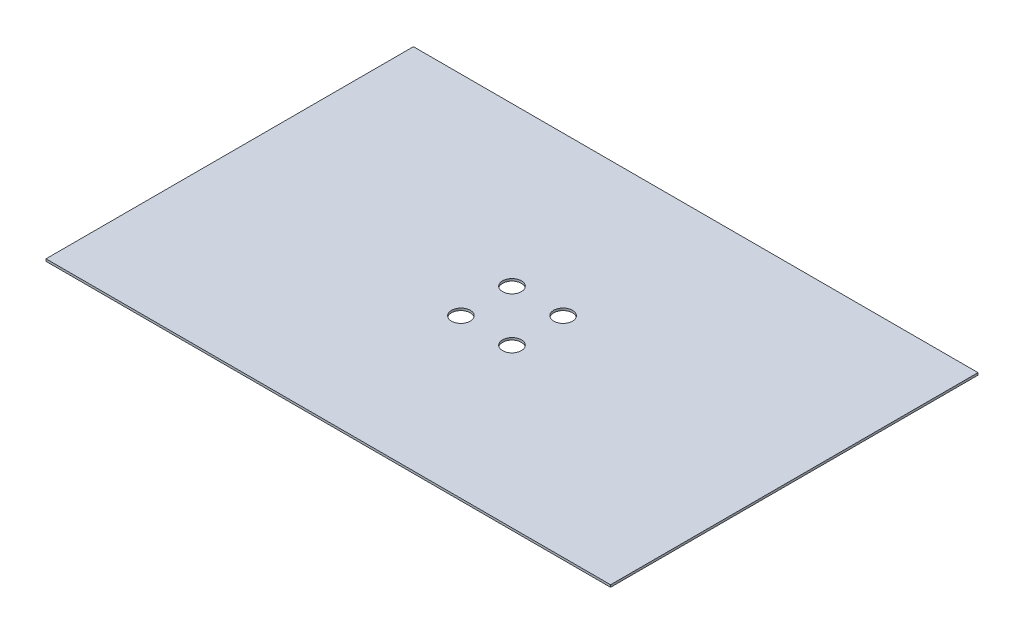
ISO-10303-21;
HEADER;
FILE_DESCRIPTION(('STEP AP214'),'2;1');
FILE_NAME('part.step','',(''),(''),'','','');
FILE_SCHEMA(('AUTOMOTIVE_DESIGN { 1 0 10303 214 1 1 1 1 }'));
ENDSEC;
DATA;
#1=APPLICATION_CONTEXT('core data for automotive mechanical design processes');
#2=APPLICATION_PROTOCOL_DEFINITION('international standard','automotive_design',2000,#1);
#3=PRODUCT_CONTEXT('',#1,'mechanical');
#4=PRODUCT('Part','Part','',(#3));
#5=PRODUCT_RELATED_PRODUCT_CATEGORY('part','',(#4));
#6=PRODUCT_DEFINITION_FORMATION('','',#4);
#7=PRODUCT_DEFINITION_CONTEXT('part definition',#1,'design');
#8=PRODUCT_DEFINITION('design','',#6,#7);
#9=PRODUCT_DEFINITION_SHAPE('','',#8);
#10=(LENGTH_UNIT() NAMED_UNIT(*) SI_UNIT(.MILLI.,.METRE.));
#11=(NAMED_UNIT(*) PLANE_ANGLE_UNIT() SI_UNIT($,.RADIAN.));
#12=(NAMED_UNIT(*) SI_UNIT($,.STERADIAN.) SOLID_ANGLE_UNIT());
#13=UNCERTAINTY_MEASURE_WITH_UNIT(LENGTH_MEASURE(1.E-05),#10,'distance_accuracy_value','');
#14=(GEOMETRIC_REPRESENTATION_CONTEXT(3) GLOBAL_UNCERTAINTY_ASSIGNED_CONTEXT((#13)) GLOBAL_UNIT_ASSIGNED_CONTEXT((#10,
#11,#12)) REPRESENTATION_CONTEXT('',''));
#15=CARTESIAN_POINT('',(0.,0.,0.));
#16=DIRECTION('',(0.,0.,1.));
#17=DIRECTION('',(1.,0.,0.));
#18=AXIS2_PLACEMENT_3D('',#15,#16,#17);
#19=CARTESIAN_POINT('',(0.,5.,0.));
#20=DIRECTION('',(0.,1.,0.));
#21=DIRECTION('',(0.,0.,1.));
#22=AXIS2_PLACEMENT_3D('',#19,#20,#21);
#23=PLANE('',#22);
#24=CARTESIAN_POINT('',(57.0000000000012,5.,56.9999999999984));
#25=DIRECTION('',(0.,1.,0.));
#26=DIRECTION('',(0.,0.,1.));
#27=AXIS2_PLACEMENT_3D('',#24,#25,#26);
#28=CIRCLE('',#27,21.);
#29=CARTESIAN_POINT('',(57.0000000000012,5.,77.9999999999984));
#30=VERTEX_POINT('',#29);
#31=EDGE_CURVE('E144',#30,#30,#28,.T.);
#32=ORIENTED_EDGE('',*,*,#31,.F.);
#33=EDGE_LOOP('',(#32));
#34=FACE_BOUND('',#33,.T.);
#35=CARTESIAN_POINT('',(-57.,5.,-57.));
#36=DIRECTION('',(0.,1.,0.));
#37=DIRECTION('',(0.,0.,1.));
#38=AXIS2_PLACEMENT_3D('',#35,#36,#37);
#39=CIRCLE('',#38,21.);
#40=CARTESIAN_POINT('',(-57.,5.,-36.));
#41=VERTEX_POINT('',#40);
#42=EDGE_CURVE('E112',#41,#41,#39,.T.);
#43=ORIENTED_EDGE('',*,*,#42,.F.);
#44=EDGE_LOOP('',(#43));
#45=FACE_BOUND('',#44,.T.);
#46=DIRECTION('',(0.,0.,-1.));
#47=VECTOR('',#46,1.);
#48=CARTESIAN_POINT('',(630.,5.,-410.));
#49=LINE('',#48,#47);
#50=CARTESIAN_POINT('',(630.,5.,410.));
#51=VERTEX_POINT('',#50);
#52=CARTESIAN_POINT('',(630.,5.,-410.));
#53=VERTEX_POINT('',#52);
#54=EDGE_CURVE('E91',#51,#53,#49,.T.);
#55=ORIENTED_EDGE('',*,*,#54,.T.);
#56=DIRECTION('',(-1.,0.,0.));
#57=VECTOR('',#56,1.);
#58=CARTESIAN_POINT('',(-630.,5.,-410.));
#59=LINE('',#58,#57);
#60=CARTESIAN_POINT('',(-630.,5.,-410.));
#61=VERTEX_POINT('',#60);
#62=EDGE_CURVE('E86',#53,#61,#59,.T.);
#63=ORIENTED_EDGE('',*,*,#62,.T.);
#64=DIRECTION('',(0.,0.,1.));
#65=VECTOR('',#64,1.);
#66=CARTESIAN_POINT('',(-630.,5.,-410.));
#67=LINE('',#66,#65);
#68=CARTESIAN_POINT('',(-630.,5.,410.));
#69=VERTEX_POINT('',#68);
#70=EDGE_CURVE('E89',#61,#69,#67,.T.);
#71=ORIENTED_EDGE('',*,*,#70,.T.);
#72=DIRECTION('',(1.,0.,0.));
#73=VECTOR('',#72,1.);
#74=CARTESIAN_POINT('',(-630.,5.,410.));
#75=LINE('',#74,#73);
#76=EDGE_CURVE('E56',#69,#51,#75,.T.);
#77=ORIENTED_EDGE('',*,*,#76,.T.);
#78=EDGE_LOOP('',(#55,#63,#71,#77));
#79=FACE_BOUND('',#78,.T.);
#80=CARTESIAN_POINT('',(57.,5.,-57.0000000000016));
#81=DIRECTION('',(0.,1.,0.));
#82=DIRECTION('',(0.,0.,1.));
#83=AXIS2_PLACEMENT_3D('',#80,#81,#82);
#84=CIRCLE('',#83,21.);
#85=CARTESIAN_POINT('',(57.,5.,-36.0000000000016));
#86=VERTEX_POINT('',#85);
#87=EDGE_CURVE('E136',#86,#86,#84,.T.);
#88=ORIENTED_EDGE('',*,*,#87,.F.);
#89=EDGE_LOOP('',(#88));
#90=FACE_BOUND('',#89,.T.);
#91=CARTESIAN_POINT('',(-56.9999999999988,5.,57.));
#92=DIRECTION('',(0.,1.,0.));
#93=DIRECTION('',(0.,0.,1.));
#94=AXIS2_PLACEMENT_3D('',#91,#92,#93);
#95=CIRCLE('',#94,21.);
#96=CARTESIAN_POINT('',(-56.9999999999988,5.,78.));
#97=VERTEX_POINT('',#96);
#98=EDGE_CURVE('E152',#97,#97,#95,.T.);
#99=ORIENTED_EDGE('',*,*,#98,.F.);
#100=EDGE_LOOP('',(#99));
#101=FACE_BOUND('',#100,.T.);
#102=ADVANCED_FACE('F38',(#34,#45,#79,#90,#101),#23,.T.);
#103=CARTESIAN_POINT('',(0.,0.,0.));
#104=DIRECTION('',(0.,1.,0.));
#105=DIRECTION('',(0.,0.,1.));
#106=AXIS2_PLACEMENT_3D('',#103,#104,#105);
#107=PLANE('',#106);
#108=DIRECTION('',(0.,0.,-1.));
#109=VECTOR('',#108,1.);
#110=CARTESIAN_POINT('',(630.,0.,-410.));
#111=LINE('',#110,#109);
#112=CARTESIAN_POINT('',(630.,0.,410.));
#113=VERTEX_POINT('',#112);
#114=CARTESIAN_POINT('',(630.,0.,-410.));
#115=VERTEX_POINT('',#114);
#116=EDGE_CURVE('E108',#113,#115,#111,.T.);
#117=ORIENTED_EDGE('',*,*,#116,.F.);
#118=DIRECTION('',(1.,0.,0.));
#119=VECTOR('',#118,1.);
#120=CARTESIAN_POINT('',(-630.,0.,410.));
#121=LINE('',#120,#119);
#122=CARTESIAN_POINT('',(-630.,0.,410.));
#123=VERTEX_POINT('',#122);
#124=EDGE_CURVE('E79',#123,#113,#121,.T.);
#125=ORIENTED_EDGE('',*,*,#124,.F.);
#126=DIRECTION('',(0.,0.,1.));
#127=VECTOR('',#126,1.);
#128=CARTESIAN_POINT('',(-630.,0.,-410.));
#129=LINE('',#128,#127);
#130=CARTESIAN_POINT('',(-630.,0.,-410.));
#131=VERTEX_POINT('',#130);
#132=EDGE_CURVE('E73',#131,#123,#129,.T.);
#133=ORIENTED_EDGE('',*,*,#132,.F.);
#134=DIRECTION('',(-1.,0.,0.));
#135=VECTOR('',#134,1.);
#136=CARTESIAN_POINT('',(-630.,0.,-410.));
#137=LINE('',#136,#135);
#138=EDGE_CURVE('E96',#115,#131,#137,.T.);
#139=ORIENTED_EDGE('',*,*,#138,.F.);
#140=EDGE_LOOP('',(#117,#125,#133,#139));
#141=FACE_BOUND('',#140,.T.);
#142=CARTESIAN_POINT('',(-57.,0.,-57.));
#143=DIRECTION('',(0.,1.,0.));
#144=DIRECTION('',(0.,0.,1.));
#145=AXIS2_PLACEMENT_3D('',#142,#143,#144);
#146=CIRCLE('',#145,21.);
#147=CARTESIAN_POINT('',(-57.,0.,-36.));
#148=VERTEX_POINT('',#147);
#149=EDGE_CURVE('E132',#148,#148,#146,.T.);
#150=ORIENTED_EDGE('',*,*,#149,.T.);
#151=EDGE_LOOP('',(#150));
#152=FACE_BOUND('',#151,.T.);
#153=CARTESIAN_POINT('',(57.,0.,-57.0000000000016));
#154=DIRECTION('',(0.,1.,0.));
#155=DIRECTION('',(0.,0.,1.));
#156=AXIS2_PLACEMENT_3D('',#153,#154,#155);
#157=CIRCLE('',#156,21.);
#158=CARTESIAN_POINT('',(57.,0.,-36.0000000000016));
#159=VERTEX_POINT('',#158);
#160=EDGE_CURVE('E140',#159,#159,#157,.T.);
#161=ORIENTED_EDGE('',*,*,#160,.T.);
#162=EDGE_LOOP('',(#161));
#163=FACE_BOUND('',#162,.T.);
#164=CARTESIAN_POINT('',(57.0000000000012,0.,56.9999999999984));
#165=DIRECTION('',(0.,1.,0.));
#166=DIRECTION('',(0.,0.,1.));
#167=AXIS2_PLACEMENT_3D('',#164,#165,#166);
#168=CIRCLE('',#167,21.);
#169=CARTESIAN_POINT('',(57.0000000000012,0.,77.9999999999984));
#170=VERTEX_POINT('',#169);
#171=EDGE_CURVE('E148',#170,#170,#168,.T.);
#172=ORIENTED_EDGE('',*,*,#171,.T.);
#173=EDGE_LOOP('',(#172));
#174=FACE_BOUND('',#173,.T.);
#175=CARTESIAN_POINT('',(-56.9999999999988,0.,57.));
#176=DIRECTION('',(0.,1.,0.));
#177=DIRECTION('',(0.,0.,1.));
#178=AXIS2_PLACEMENT_3D('',#175,#176,#177);
#179=CIRCLE('',#178,21.);
#180=CARTESIAN_POINT('',(-56.9999999999988,0.,78.));
#181=VERTEX_POINT('',#180);
#182=EDGE_CURVE('E156',#181,#181,#179,.T.);
#183=ORIENTED_EDGE('',*,*,#182,.T.);
#184=EDGE_LOOP('',(#183));
#185=FACE_BOUND('',#184,.T.);
#186=ADVANCED_FACE('F126',(#141,#152,#163,#174,#185),#107,.F.);
#187=CARTESIAN_POINT('',(630.,5.,-410.));
#188=DIRECTION('',(-1.,0.,0.));
#189=DIRECTION('',(0.,0.,1.));
#190=AXIS2_PLACEMENT_3D('',#187,#188,#189);
#191=PLANE('',#190);
#192=ORIENTED_EDGE('',*,*,#116,.T.);
#193=DIRECTION('',(0.,-1.,0.));
#194=VECTOR('',#193,1.);
#195=CARTESIAN_POINT('',(630.,5.,-410.));
#196=LINE('',#195,#194);
#197=EDGE_CURVE('E11',#53,#115,#196,.T.);
#198=ORIENTED_EDGE('',*,*,#197,.F.);
#199=ORIENTED_EDGE('',*,*,#54,.F.);
#200=DIRECTION('',(0.,-1.,0.));
#201=VECTOR('',#200,1.);
#202=CARTESIAN_POINT('',(630.,5.,410.));
#203=LINE('',#202,#201);
#204=EDGE_CURVE('E104',#51,#113,#203,.T.);
#205=ORIENTED_EDGE('',*,*,#204,.T.);
#206=EDGE_LOOP('',(#192,#198,#199,#205));
#207=FACE_BOUND('',#206,.T.);
#208=ADVANCED_FACE('F40',(#207),#191,.F.);
#209=CARTESIAN_POINT('',(-630.,5.,-410.));
#210=DIRECTION('',(0.,0.,1.));
#211=DIRECTION('',(1.,0.,0.));
#212=AXIS2_PLACEMENT_3D('',#209,#210,#211);
#213=PLANE('',#212);
#214=ORIENTED_EDGE('',*,*,#138,.T.);
#215=DIRECTION('',(0.,-1.,0.));
#216=VECTOR('',#215,1.);
#217=CARTESIAN_POINT('',(-630.,5.,-410.));
#218=LINE('',#217,#216);
#219=EDGE_CURVE('E48',#61,#131,#218,.T.);
#220=ORIENTED_EDGE('',*,*,#219,.F.);
#221=ORIENTED_EDGE('',*,*,#62,.F.);
#222=ORIENTED_EDGE('',*,*,#197,.T.);
#223=EDGE_LOOP('',(#214,#220,#221,#222));
#224=FACE_BOUND('',#223,.T.);
#225=ADVANCED_FACE('F95',(#224),#213,.F.);
#226=CARTESIAN_POINT('',(-630.,5.,-410.));
#227=DIRECTION('',(1.,0.,0.));
#228=DIRECTION('',(0.,0.,-1.));
#229=AXIS2_PLACEMENT_3D('',#226,#227,#228);
#230=PLANE('',#229);
#231=ORIENTED_EDGE('',*,*,#132,.T.);
#232=DIRECTION('',(0.,-1.,0.));
#233=VECTOR('',#232,1.);
#234=CARTESIAN_POINT('',(-630.,5.,410.));
#235=LINE('',#234,#233);
#236=EDGE_CURVE('E98',#69,#123,#235,.T.);
#237=ORIENTED_EDGE('',*,*,#236,.F.);
#238=ORIENTED_EDGE('',*,*,#70,.F.);
#239=ORIENTED_EDGE('',*,*,#219,.T.);
#240=EDGE_LOOP('',(#231,#237,#238,#239));
#241=FACE_BOUND('',#240,.T.);
#242=ADVANCED_FACE('F99',(#241),#230,.F.);
#243=CARTESIAN_POINT('',(-630.,5.,410.));
#244=DIRECTION('',(0.,0.,-1.));
#245=DIRECTION('',(-1.,0.,0.));
#246=AXIS2_PLACEMENT_3D('',#243,#244,#245);
#247=PLANE('',#246);
#248=ORIENTED_EDGE('',*,*,#124,.T.);
#249=ORIENTED_EDGE('',*,*,#204,.F.);
#250=ORIENTED_EDGE('',*,*,#76,.F.);
#251=ORIENTED_EDGE('',*,*,#236,.T.);
#252=EDGE_LOOP('',(#248,#249,#250,#251));
#253=FACE_BOUND('',#252,.T.);
#254=ADVANCED_FACE('F123',(#253),#247,.F.);
#255=CARTESIAN_POINT('',(-57.,5.,-57.));
#256=DIRECTION('',(0.,-1.,0.));
#257=DIRECTION('',(0.,0.,-1.));
#258=AXIS2_PLACEMENT_3D('',#255,#256,#257);
#259=CYLINDRICAL_SURFACE('',#258,21.);
#260=ORIENTED_EDGE('',*,*,#42,.T.);
#261=EDGE_LOOP('',(#260));
#262=FACE_BOUND('',#261,.T.);
#263=ORIENTED_EDGE('',*,*,#149,.F.);
#264=EDGE_LOOP('',(#263));
#265=FACE_BOUND('',#264,.T.);
#266=ADVANCED_FACE('F178',(#262,#265),#259,.F.);
#267=CARTESIAN_POINT('',(57.,5.,-57.0000000000016));
#268=DIRECTION('',(0.,-1.,0.));
#269=DIRECTION('',(0.,0.,-1.));
#270=AXIS2_PLACEMENT_3D('',#267,#268,#269);
#271=CYLINDRICAL_SURFACE('',#270,21.);
#272=ORIENTED_EDGE('',*,*,#87,.T.);
#273=EDGE_LOOP('',(#272));
#274=FACE_BOUND('',#273,.T.);
#275=ORIENTED_EDGE('',*,*,#160,.F.);
#276=EDGE_LOOP('',(#275));
#277=FACE_BOUND('',#276,.T.);
#278=ADVANCED_FACE('F233',(#274,#277),#271,.F.);
#279=CARTESIAN_POINT('',(57.0000000000012,5.,56.9999999999984));
#280=DIRECTION('',(0.,-1.,0.));
#281=DIRECTION('',(0.,0.,-1.));
#282=AXIS2_PLACEMENT_3D('',#279,#280,#281);
#283=CYLINDRICAL_SURFACE('',#282,21.);
#284=ORIENTED_EDGE('',*,*,#31,.T.);
#285=EDGE_LOOP('',(#284));
#286=FACE_BOUND('',#285,.T.);
#287=ORIENTED_EDGE('',*,*,#171,.F.);
#288=EDGE_LOOP('',(#287));
#289=FACE_BOUND('',#288,.T.);
#290=ADVANCED_FACE('F242',(#286,#289),#283,.F.);
#291=CARTESIAN_POINT('',(-56.9999999999988,5.,57.));
#292=DIRECTION('',(0.,-1.,0.));
#293=DIRECTION('',(0.,0.,-1.));
#294=AXIS2_PLACEMENT_3D('',#291,#292,#293);
#295=CYLINDRICAL_SURFACE('',#294,21.);
#296=ORIENTED_EDGE('',*,*,#98,.T.);
#297=EDGE_LOOP('',(#296));
#298=FACE_BOUND('',#297,.T.);
#299=ORIENTED_EDGE('',*,*,#182,.F.);
#300=EDGE_LOOP('',(#299));
#301=FACE_BOUND('',#300,.T.);
#302=ADVANCED_FACE('F165',(#298,#301),#295,.F.);
#303=CLOSED_SHELL('',(#102,#186,#208,#225,#242,#254,#266,#278,#290,#302));
#304=MANIFOLD_SOLID_BREP('B2',#303);
#305=ADVANCED_BREP_SHAPE_REPRESENTATION('',(#18,#304),#14);
#306=SHAPE_DEFINITION_REPRESENTATION(#9,#305);
ENDSEC;
END-ISO-10303-21;
